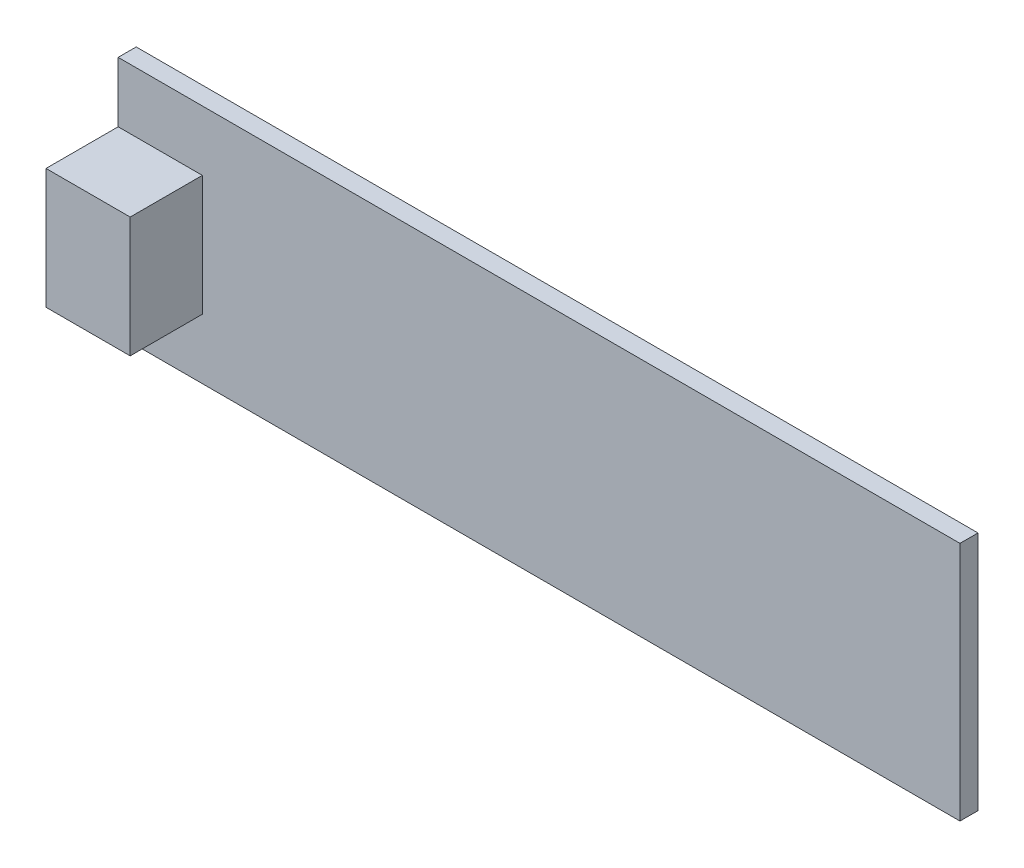
ISO-10303-21;
HEADER;
FILE_DESCRIPTION(('STEP AP214'),'2;1');
FILE_NAME('part.step','',(''),(''),'','','');
FILE_SCHEMA(('AUTOMOTIVE_DESIGN { 1 0 10303 214 1 1 1 1 }'));
ENDSEC;
DATA;
#1=APPLICATION_CONTEXT('core data for automotive mechanical design processes');
#2=APPLICATION_PROTOCOL_DEFINITION('international standard','automotive_design',2000,#1);
#3=PRODUCT_CONTEXT('',#1,'mechanical');
#4=PRODUCT('Part','Part','',(#3));
#5=PRODUCT_RELATED_PRODUCT_CATEGORY('part','',(#4));
#6=PRODUCT_DEFINITION_FORMATION('','',#4);
#7=PRODUCT_DEFINITION_CONTEXT('part definition',#1,'design');
#8=PRODUCT_DEFINITION('design','',#6,#7);
#9=PRODUCT_DEFINITION_SHAPE('','',#8);
#10=(LENGTH_UNIT() NAMED_UNIT(*) SI_UNIT(.MILLI.,.METRE.));
#11=(NAMED_UNIT(*) PLANE_ANGLE_UNIT() SI_UNIT($,.RADIAN.));
#12=(NAMED_UNIT(*) SI_UNIT($,.STERADIAN.) SOLID_ANGLE_UNIT());
#13=UNCERTAINTY_MEASURE_WITH_UNIT(LENGTH_MEASURE(1.E-05),#10,'distance_accuracy_value','');
#14=(GEOMETRIC_REPRESENTATION_CONTEXT(3) GLOBAL_UNCERTAINTY_ASSIGNED_CONTEXT((#13)) GLOBAL_UNIT_ASSIGNED_CONTEXT((#10,
#11,#12)) REPRESENTATION_CONTEXT('',''));
#15=CARTESIAN_POINT('',(0.,0.,0.));
#16=DIRECTION('',(0.,0.,1.));
#17=DIRECTION('',(1.,0.,0.));
#18=AXIS2_PLACEMENT_3D('',#15,#16,#17);
#19=CARTESIAN_POINT('',(0.,0.,0.75));
#20=DIRECTION('',(0.,0.,-1.));
#21=DIRECTION('',(-1.,0.,0.));
#22=AXIS2_PLACEMENT_3D('',#19,#20,#21);
#23=PLANE('',#22);
#24=DIRECTION('',(-1.,0.,0.));
#25=VECTOR('',#24,1.);
#26=CARTESIAN_POINT('',(-28.,5.,0.75));
#27=LINE('',#26,#25);
#28=CARTESIAN_POINT('',(-28.,5.,0.75));
#29=VERTEX_POINT('',#28);
#30=CARTESIAN_POINT('',(-35.,5.,0.75));
#31=VERTEX_POINT('',#30);
#32=EDGE_CURVE('E57',#29,#31,#27,.T.);
#33=ORIENTED_EDGE('',*,*,#32,.F.);
#34=DIRECTION('',(0.,1.,0.));
#35=VECTOR('',#34,1.);
#36=CARTESIAN_POINT('',(-28.,-5.,0.75));
#37=LINE('',#36,#35);
#38=CARTESIAN_POINT('',(-28.,-5.,0.75));
#39=VERTEX_POINT('',#38);
#40=EDGE_CURVE('E262',#39,#29,#37,.T.);
#41=ORIENTED_EDGE('',*,*,#40,.F.);
#42=DIRECTION('',(1.,0.,0.));
#43=VECTOR('',#42,1.);
#44=CARTESIAN_POINT('',(-28.,-5.,0.75));
#45=LINE('',#44,#43);
#46=CARTESIAN_POINT('',(-35.,-5.,0.75));
#47=VERTEX_POINT('',#46);
#48=EDGE_CURVE('E63',#47,#39,#45,.T.);
#49=ORIENTED_EDGE('',*,*,#48,.F.);
#50=DIRECTION('',(0.,-1.,0.));
#51=VECTOR('',#50,1.);
#52=CARTESIAN_POINT('',(-35.,-10.,0.75));
#53=LINE('',#52,#51);
#54=CARTESIAN_POINT('',(-35.,-10.,0.75));
#55=VERTEX_POINT('',#54);
#56=EDGE_CURVE('E128',#47,#55,#53,.T.);
#57=ORIENTED_EDGE('',*,*,#56,.T.);
#58=DIRECTION('',(1.,0.,0.));
#59=VECTOR('',#58,1.);
#60=CARTESIAN_POINT('',(-35.,-10.,0.75));
#61=LINE('',#60,#59);
#62=CARTESIAN_POINT('',(35.,-10.,0.75));
#63=VERTEX_POINT('',#62);
#64=EDGE_CURVE('E146',#55,#63,#61,.T.);
#65=ORIENTED_EDGE('',*,*,#64,.T.);
#66=DIRECTION('',(0.,1.,0.));
#67=VECTOR('',#66,1.);
#68=CARTESIAN_POINT('',(35.,-10.,0.75));
#69=LINE('',#68,#67);
#70=CARTESIAN_POINT('',(35.,10.,0.75));
#71=VERTEX_POINT('',#70);
#72=EDGE_CURVE('E138',#63,#71,#69,.T.);
#73=ORIENTED_EDGE('',*,*,#72,.T.);
#74=DIRECTION('',(-1.,0.,0.));
#75=VECTOR('',#74,1.);
#76=CARTESIAN_POINT('',(-35.,10.,0.75));
#77=LINE('',#76,#75);
#78=CARTESIAN_POINT('',(-35.,10.,0.75));
#79=VERTEX_POINT('',#78);
#80=EDGE_CURVE('E141',#71,#79,#77,.T.);
#81=ORIENTED_EDGE('',*,*,#80,.T.);
#82=EDGE_CURVE('E144',#79,#31,#53,.T.);
#83=ORIENTED_EDGE('',*,*,#82,.T.);
#84=EDGE_LOOP('',(#33,#41,#49,#57,#65,#73,#81,#83));
#85=FACE_BOUND('',#84,.T.);
#86=ADVANCED_FACE('F42',(#85),#23,.F.);
#87=CARTESIAN_POINT('',(35.,-10.,0.75));
#88=DIRECTION('',(-1.,0.,0.));
#89=DIRECTION('',(0.,0.,1.));
#90=AXIS2_PLACEMENT_3D('',#87,#88,#89);
#91=PLANE('',#90);
#92=DIRECTION('',(0.,1.,0.));
#93=VECTOR('',#92,1.);
#94=CARTESIAN_POINT('',(35.,-10.,-0.75));
#95=LINE('',#94,#93);
#96=CARTESIAN_POINT('',(35.,-10.,-0.75));
#97=VERTEX_POINT('',#96);
#98=CARTESIAN_POINT('',(35.,10.,-0.75));
#99=VERTEX_POINT('',#98);
#100=EDGE_CURVE('E129',#97,#99,#95,.T.);
#101=ORIENTED_EDGE('',*,*,#100,.T.);
#102=DIRECTION('',(0.,0.,-1.));
#103=VECTOR('',#102,1.);
#104=CARTESIAN_POINT('',(35.,10.,0.75));
#105=LINE('',#104,#103);
#106=EDGE_CURVE('E11',#71,#99,#105,.T.);
#107=ORIENTED_EDGE('',*,*,#106,.F.);
#108=ORIENTED_EDGE('',*,*,#72,.F.);
#109=DIRECTION('',(0.,0.,-1.));
#110=VECTOR('',#109,1.);
#111=CARTESIAN_POINT('',(35.,-10.,0.75));
#112=LINE('',#111,#110);
#113=EDGE_CURVE('E147',#63,#97,#112,.T.);
#114=ORIENTED_EDGE('',*,*,#113,.T.);
#115=EDGE_LOOP('',(#101,#107,#108,#114));
#116=FACE_BOUND('',#115,.T.);
#117=ADVANCED_FACE('F44',(#116),#91,.F.);
#118=CARTESIAN_POINT('',(-35.,10.,0.75));
#119=DIRECTION('',(0.,-1.,0.));
#120=DIRECTION('',(0.,0.,-1.));
#121=AXIS2_PLACEMENT_3D('',#118,#119,#120);
#122=PLANE('',#121);
#123=DIRECTION('',(-1.,0.,0.));
#124=VECTOR('',#123,1.);
#125=CARTESIAN_POINT('',(-35.,10.,-0.75));
#126=LINE('',#125,#124);
#127=CARTESIAN_POINT('',(-35.,10.,-0.75));
#128=VERTEX_POINT('',#127);
#129=EDGE_CURVE('E132',#99,#128,#126,.T.);
#130=ORIENTED_EDGE('',*,*,#129,.T.);
#131=DIRECTION('',(0.,0.,-1.));
#132=VECTOR('',#131,1.);
#133=CARTESIAN_POINT('',(-35.,10.,0.75));
#134=LINE('',#133,#132);
#135=EDGE_CURVE('E50',#79,#128,#134,.T.);
#136=ORIENTED_EDGE('',*,*,#135,.F.);
#137=ORIENTED_EDGE('',*,*,#80,.F.);
#138=ORIENTED_EDGE('',*,*,#106,.T.);
#139=EDGE_LOOP('',(#130,#136,#137,#138));
#140=FACE_BOUND('',#139,.T.);
#141=ADVANCED_FACE('F173',(#140),#122,.F.);
#142=CARTESIAN_POINT('',(-35.,-10.,0.75));
#143=DIRECTION('',(1.,0.,0.));
#144=DIRECTION('',(0.,0.,-1.));
#145=AXIS2_PLACEMENT_3D('',#142,#143,#144);
#146=PLANE('',#145);
#147=DIRECTION('',(0.,-1.,0.));
#148=VECTOR('',#147,1.);
#149=CARTESIAN_POINT('',(-35.,-10.,-0.75));
#150=LINE('',#149,#148);
#151=CARTESIAN_POINT('',(-35.,-10.,-0.75));
#152=VERTEX_POINT('',#151);
#153=EDGE_CURVE('E150',#128,#152,#150,.T.);
#154=ORIENTED_EDGE('',*,*,#153,.T.);
#155=DIRECTION('',(0.,0.,-1.));
#156=VECTOR('',#155,1.);
#157=CARTESIAN_POINT('',(-35.,-10.,0.75));
#158=LINE('',#157,#156);
#159=EDGE_CURVE('E155',#55,#152,#158,.T.);
#160=ORIENTED_EDGE('',*,*,#159,.F.);
#161=ORIENTED_EDGE('',*,*,#56,.F.);
#162=DIRECTION('',(0.,0.,-1.));
#163=VECTOR('',#162,1.);
#164=CARTESIAN_POINT('',(-35.,-5.,6.75));
#165=LINE('',#164,#163);
#166=CARTESIAN_POINT('',(-35.,-5.,6.75));
#167=VERTEX_POINT('',#166);
#168=EDGE_CURVE('E110',#167,#47,#165,.T.);
#169=ORIENTED_EDGE('',*,*,#168,.F.);
#170=DIRECTION('',(0.,-1.,0.));
#171=VECTOR('',#170,1.);
#172=CARTESIAN_POINT('',(-35.,-5.,6.75));
#173=LINE('',#172,#171);
#174=CARTESIAN_POINT('',(-35.,5.,6.75));
#175=VERTEX_POINT('',#174);
#176=EDGE_CURVE('E116',#175,#167,#173,.T.);
#177=ORIENTED_EDGE('',*,*,#176,.F.);
#178=DIRECTION('',(0.,0.,-1.));
#179=VECTOR('',#178,1.);
#180=CARTESIAN_POINT('',(-35.,5.,6.75));
#181=LINE('',#180,#179);
#182=EDGE_CURVE('E260',#175,#31,#181,.T.);
#183=ORIENTED_EDGE('',*,*,#182,.T.);
#184=ORIENTED_EDGE('',*,*,#82,.F.);
#185=ORIENTED_EDGE('',*,*,#135,.T.);
#186=EDGE_LOOP('',(#154,#160,#161,#169,#177,#183,#184,#185));
#187=FACE_BOUND('',#186,.T.);
#188=ADVANCED_FACE('F126',(#187),#146,.F.);
#189=CARTESIAN_POINT('',(-35.,-10.,0.75));
#190=DIRECTION('',(0.,1.,0.));
#191=DIRECTION('',(0.,0.,1.));
#192=AXIS2_PLACEMENT_3D('',#189,#190,#191);
#193=PLANE('',#192);
#194=DIRECTION('',(1.,0.,0.));
#195=VECTOR('',#194,1.);
#196=CARTESIAN_POINT('',(-35.,-10.,-0.75));
#197=LINE('',#196,#195);
#198=EDGE_CURVE('E142',#152,#97,#197,.T.);
#199=ORIENTED_EDGE('',*,*,#198,.T.);
#200=ORIENTED_EDGE('',*,*,#113,.F.);
#201=ORIENTED_EDGE('',*,*,#64,.F.);
#202=ORIENTED_EDGE('',*,*,#159,.T.);
#203=EDGE_LOOP('',(#199,#200,#201,#202));
#204=FACE_BOUND('',#203,.T.);
#205=ADVANCED_FACE('F168',(#204),#193,.F.);
#206=CARTESIAN_POINT('',(0.,0.,-0.75));
#207=DIRECTION('',(0.,0.,-1.));
#208=DIRECTION('',(-1.,0.,0.));
#209=AXIS2_PLACEMENT_3D('',#206,#207,#208);
#210=PLANE('',#209);
#211=ORIENTED_EDGE('',*,*,#100,.F.);
#212=ORIENTED_EDGE('',*,*,#198,.F.);
#213=ORIENTED_EDGE('',*,*,#153,.F.);
#214=ORIENTED_EDGE('',*,*,#129,.F.);
#215=EDGE_LOOP('',(#211,#212,#213,#214));
#216=FACE_BOUND('',#215,.T.);
#217=ADVANCED_FACE('F165',(#216),#210,.T.);
#218=CARTESIAN_POINT('',(-28.,-5.,6.75));
#219=DIRECTION('',(0.,1.,0.));
#220=DIRECTION('',(-1.,0.,0.));
#221=AXIS2_PLACEMENT_3D('',#218,#219,#220);
#222=PLANE('',#221);
#223=ORIENTED_EDGE('',*,*,#48,.T.);
#224=DIRECTION('',(0.,0.,-1.));
#225=VECTOR('',#224,1.);
#226=CARTESIAN_POINT('',(-28.,-5.,6.75));
#227=LINE('',#226,#225);
#228=CARTESIAN_POINT('',(-28.,-5.,6.75));
#229=VERTEX_POINT('',#228);
#230=EDGE_CURVE('E112',#229,#39,#227,.T.);
#231=ORIENTED_EDGE('',*,*,#230,.F.);
#232=DIRECTION('',(1.,0.,0.));
#233=VECTOR('',#232,1.);
#234=CARTESIAN_POINT('',(-28.,-5.,6.75));
#235=LINE('',#234,#233);
#236=EDGE_CURVE('E106',#167,#229,#235,.T.);
#237=ORIENTED_EDGE('',*,*,#236,.F.);
#238=ORIENTED_EDGE('',*,*,#168,.T.);
#239=EDGE_LOOP('',(#223,#231,#237,#238));
#240=FACE_BOUND('',#239,.T.);
#241=ADVANCED_FACE('F108',(#240),#222,.F.);
#242=CARTESIAN_POINT('',(-28.,-5.,6.75));
#243=DIRECTION('',(-1.,0.,0.));
#244=DIRECTION('',(0.,0.,1.));
#245=AXIS2_PLACEMENT_3D('',#242,#243,#244);
#246=PLANE('',#245);
#247=ORIENTED_EDGE('',*,*,#40,.T.);
#248=DIRECTION('',(0.,0.,-1.));
#249=VECTOR('',#248,1.);
#250=CARTESIAN_POINT('',(-28.,5.,6.75));
#251=LINE('',#250,#249);
#252=CARTESIAN_POINT('',(-28.,5.,6.75));
#253=VERTEX_POINT('',#252);
#254=EDGE_CURVE('E134',#253,#29,#251,.T.);
#255=ORIENTED_EDGE('',*,*,#254,.F.);
#256=DIRECTION('',(0.,1.,0.));
#257=VECTOR('',#256,1.);
#258=CARTESIAN_POINT('',(-28.,-5.,6.75));
#259=LINE('',#258,#257);
#260=EDGE_CURVE('E115',#229,#253,#259,.T.);
#261=ORIENTED_EDGE('',*,*,#260,.F.);
#262=ORIENTED_EDGE('',*,*,#230,.T.);
#263=EDGE_LOOP('',(#247,#255,#261,#262));
#264=FACE_BOUND('',#263,.T.);
#265=ADVANCED_FACE('F204',(#264),#246,.F.);
#266=CARTESIAN_POINT('',(-28.,5.,6.75));
#267=DIRECTION('',(0.,-1.,0.));
#268=DIRECTION('',(1.,0.,0.));
#269=AXIS2_PLACEMENT_3D('',#266,#267,#268);
#270=PLANE('',#269);
#271=ORIENTED_EDGE('',*,*,#32,.T.);
#272=ORIENTED_EDGE('',*,*,#182,.F.);
#273=DIRECTION('',(-1.,0.,0.));
#274=VECTOR('',#273,1.);
#275=CARTESIAN_POINT('',(-28.,5.,6.75));
#276=LINE('',#275,#274);
#277=EDGE_CURVE('E121',#253,#175,#276,.T.);
#278=ORIENTED_EDGE('',*,*,#277,.F.);
#279=ORIENTED_EDGE('',*,*,#254,.T.);
#280=EDGE_LOOP('',(#271,#272,#278,#279));
#281=FACE_BOUND('',#280,.T.);
#282=ADVANCED_FACE('F210',(#281),#270,.F.);
#283=CARTESIAN_POINT('',(0.,0.,6.75));
#284=DIRECTION('',(0.,0.,1.));
#285=DIRECTION('',(1.,0.,0.));
#286=AXIS2_PLACEMENT_3D('',#283,#284,#285);
#287=PLANE('',#286);
#288=ORIENTED_EDGE('',*,*,#176,.T.);
#289=ORIENTED_EDGE('',*,*,#236,.T.);
#290=ORIENTED_EDGE('',*,*,#260,.T.);
#291=ORIENTED_EDGE('',*,*,#277,.T.);
#292=EDGE_LOOP('',(#288,#289,#290,#291));
#293=FACE_BOUND('',#292,.T.);
#294=ADVANCED_FACE('F119',(#293),#287,.T.);
#295=CLOSED_SHELL('',(#86,#117,#141,#188,#205,#217,#241,#265,#282,#294));
#296=MANIFOLD_SOLID_BREP('B2',#295);
#297=ADVANCED_BREP_SHAPE_REPRESENTATION('',(#18,#296),#14);
#298=SHAPE_DEFINITION_REPRESENTATION(#9,#297);
ENDSEC;
END-ISO-10303-21;
